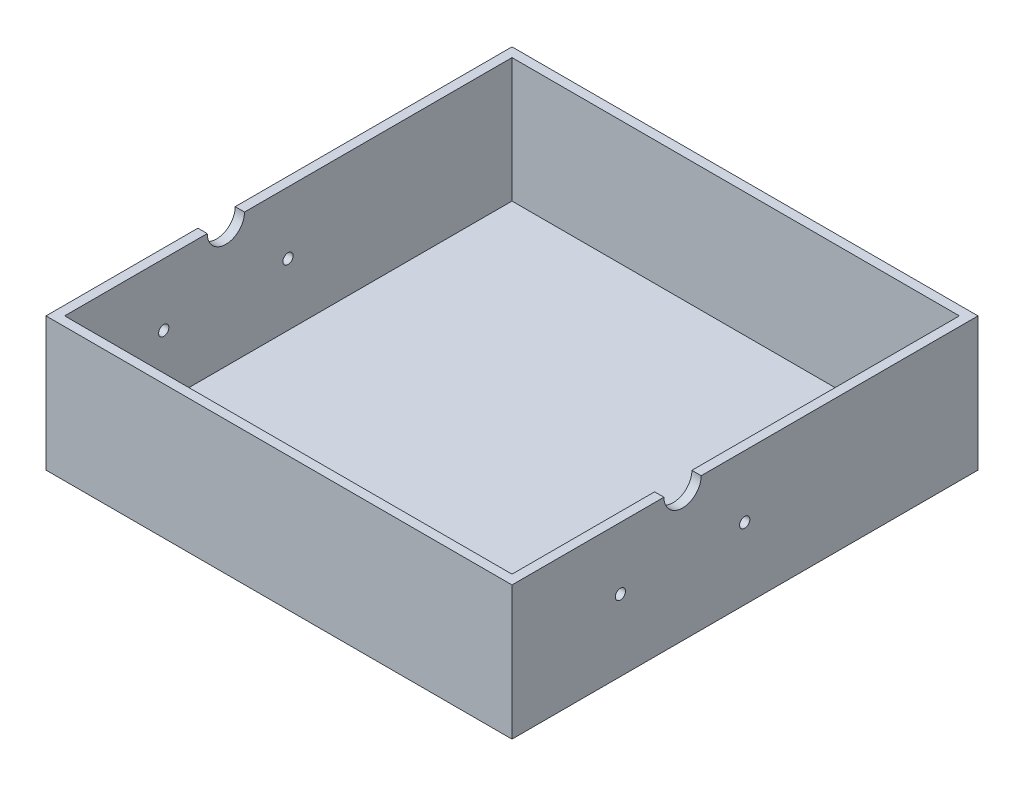
ISO-10303-21;
HEADER;
FILE_DESCRIPTION(('STEP AP214'),'2;1');
FILE_NAME('part.step','',(''),(''),'','','');
FILE_SCHEMA(('AUTOMOTIVE_DESIGN { 1 0 10303 214 1 1 1 1 }'));
ENDSEC;
DATA;
#1=APPLICATION_CONTEXT('core data for automotive mechanical design processes');
#2=APPLICATION_PROTOCOL_DEFINITION('international standard','automotive_design',2000,#1);
#3=PRODUCT_CONTEXT('',#1,'mechanical');
#4=PRODUCT('Part','Part','',(#3));
#5=PRODUCT_RELATED_PRODUCT_CATEGORY('part','',(#4));
#6=PRODUCT_DEFINITION_FORMATION('','',#4);
#7=PRODUCT_DEFINITION_CONTEXT('part definition',#1,'design');
#8=PRODUCT_DEFINITION('design','',#6,#7);
#9=PRODUCT_DEFINITION_SHAPE('','',#8);
#10=(LENGTH_UNIT() NAMED_UNIT(*) SI_UNIT(.MILLI.,.METRE.));
#11=(NAMED_UNIT(*) PLANE_ANGLE_UNIT() SI_UNIT($,.RADIAN.));
#12=(NAMED_UNIT(*) SI_UNIT($,.STERADIAN.) SOLID_ANGLE_UNIT());
#13=UNCERTAINTY_MEASURE_WITH_UNIT(LENGTH_MEASURE(1.E-05),#10,'distance_accuracy_value','');
#14=(GEOMETRIC_REPRESENTATION_CONTEXT(3) GLOBAL_UNCERTAINTY_ASSIGNED_CONTEXT((#13)) GLOBAL_UNIT_ASSIGNED_CONTEXT((#10,
#11,#12)) REPRESENTATION_CONTEXT('',''));
#15=CARTESIAN_POINT('',(0.,0.,0.));
#16=DIRECTION('',(0.,0.,1.));
#17=DIRECTION('',(1.,0.,0.));
#18=AXIS2_PLACEMENT_3D('',#15,#16,#17);
#19=CARTESIAN_POINT('',(0.,43.,0.));
#20=DIRECTION('',(0.,1.,0.));
#21=DIRECTION('',(0.,0.,1.));
#22=AXIS2_PLACEMENT_3D('',#19,#20,#21);
#23=PLANE('',#22);
#24=DIRECTION('',(1.,0.,0.));
#25=VECTOR('',#24,1.);
#26=CARTESIAN_POINT('',(-75.,43.,26.1));
#27=LINE('',#26,#25);
#28=CARTESIAN_POINT('',(-75.,43.,26.1));
#29=VERTEX_POINT('',#28);
#30=CARTESIAN_POINT('',(-72.,43.,26.1));
#31=VERTEX_POINT('',#30);
#32=EDGE_CURVE('E55',#29,#31,#27,.T.);
#33=ORIENTED_EDGE('',*,*,#32,.F.);
#34=DIRECTION('',(0.,0.,1.));
#35=VECTOR('',#34,1.);
#36=CARTESIAN_POINT('',(-75.,43.,75.));
#37=LINE('',#36,#35);
#38=CARTESIAN_POINT('',(-75.,43.,75.));
#39=VERTEX_POINT('',#38);
#40=EDGE_CURVE('E144',#29,#39,#37,.T.);
#41=ORIENTED_EDGE('',*,*,#40,.T.);
#42=DIRECTION('',(1.,0.,0.));
#43=VECTOR('',#42,1.);
#44=CARTESIAN_POINT('',(75.,43.,75.));
#45=LINE('',#44,#43);
#46=CARTESIAN_POINT('',(75.,43.,75.));
#47=VERTEX_POINT('',#46);
#48=EDGE_CURVE('E154',#39,#47,#45,.T.);
#49=ORIENTED_EDGE('',*,*,#48,.T.);
#50=DIRECTION('',(0.,0.,-1.));
#51=VECTOR('',#50,1.);
#52=CARTESIAN_POINT('',(75.,43.,75.));
#53=LINE('',#52,#51);
#54=CARTESIAN_POINT('',(75.,43.,26.1));
#55=VERTEX_POINT('',#54);
#56=EDGE_CURVE('E165',#47,#55,#53,.T.);
#57=ORIENTED_EDGE('',*,*,#56,.T.);
#58=CARTESIAN_POINT('',(72.,43.,26.1));
#59=VERTEX_POINT('',#58);
#60=EDGE_CURVE('E220',#59,#55,#27,.T.);
#61=ORIENTED_EDGE('',*,*,#60,.F.);
#62=DIRECTION('',(0.,0.,-1.));
#63=VECTOR('',#62,1.);
#64=CARTESIAN_POINT('',(72.,43.,72.));
#65=LINE('',#64,#63);
#66=CARTESIAN_POINT('',(72.,43.,72.));
#67=VERTEX_POINT('',#66);
#68=EDGE_CURVE('E233',#67,#59,#65,.T.);
#69=ORIENTED_EDGE('',*,*,#68,.F.);
#70=DIRECTION('',(1.,0.,0.));
#71=VECTOR('',#70,1.);
#72=CARTESIAN_POINT('',(72.,43.,72.));
#73=LINE('',#72,#71);
#74=CARTESIAN_POINT('',(-72.,43.,72.));
#75=VERTEX_POINT('',#74);
#76=EDGE_CURVE('E228',#75,#67,#73,.T.);
#77=ORIENTED_EDGE('',*,*,#76,.F.);
#78=DIRECTION('',(0.,0.,1.));
#79=VECTOR('',#78,1.);
#80=CARTESIAN_POINT('',(-72.,43.,72.));
#81=LINE('',#80,#79);
#82=EDGE_CURVE('E229',#31,#75,#81,.T.);
#83=ORIENTED_EDGE('',*,*,#82,.F.);
#84=EDGE_LOOP('',(#33,#41,#49,#57,#61,#69,#77,#83));
#85=FACE_BOUND('',#84,.T.);
#86=ADVANCED_FACE('F39',(#85),#23,.T.);
#87=CARTESIAN_POINT('',(75.,3.,75.));
#88=DIRECTION('',(-1.,0.,0.));
#89=DIRECTION('',(0.,0.,1.));
#90=AXIS2_PLACEMENT_3D('',#87,#88,#89);
#91=PLANE('',#90);
#92=CARTESIAN_POINT('',(75.,23.,0.0999999999999959));
#93=DIRECTION('',(1.,0.,0.));
#94=DIRECTION('',(0.,0.,-1.));
#95=AXIS2_PLACEMENT_3D('',#92,#93,#94);
#96=CIRCLE('',#95,1.65);
#97=CARTESIAN_POINT('',(75.,23.,-1.55));
#98=VERTEX_POINT('',#97);
#99=EDGE_CURVE('E306',#98,#98,#96,.T.);
#100=ORIENTED_EDGE('',*,*,#99,.F.);
#101=EDGE_LOOP('',(#100));
#102=FACE_BOUND('',#101,.T.);
#103=CARTESIAN_POINT('',(75.,23.,40.1));
#104=DIRECTION('',(1.,0.,0.));
#105=DIRECTION('',(0.,0.,-1.));
#106=AXIS2_PLACEMENT_3D('',#103,#104,#105);
#107=CIRCLE('',#106,1.65);
#108=CARTESIAN_POINT('',(75.,23.,38.45));
#109=VERTEX_POINT('',#108);
#110=EDGE_CURVE('E216',#109,#109,#107,.T.);
#111=ORIENTED_EDGE('',*,*,#110,.F.);
#112=EDGE_LOOP('',(#111));
#113=FACE_BOUND('',#112,.T.);
#114=CARTESIAN_POINT('',(75.,43.,14.1));
#115=VERTEX_POINT('',#114);
#116=CARTESIAN_POINT('',(75.,43.,-75.));
#117=VERTEX_POINT('',#116);
#118=EDGE_CURVE('E159',#115,#117,#53,.T.);
#119=ORIENTED_EDGE('',*,*,#118,.F.);
#120=CARTESIAN_POINT('',(75.,43.,20.1));
#121=DIRECTION('',(1.,0.,0.));
#122=DIRECTION('',(0.,0.,-1.));
#123=AXIS2_PLACEMENT_3D('',#120,#121,#122);
#124=CIRCLE('',#123,6.);
#125=EDGE_CURVE('E147',#55,#115,#124,.T.);
#126=ORIENTED_EDGE('',*,*,#125,.F.);
#127=ORIENTED_EDGE('',*,*,#56,.F.);
#128=DIRECTION('',(0.,-1.,0.));
#129=VECTOR('',#128,1.);
#130=CARTESIAN_POINT('',(75.,3.,75.));
#131=LINE('',#130,#129);
#132=CARTESIAN_POINT('',(75.,0.,75.));
#133=VERTEX_POINT('',#132);
#134=EDGE_CURVE('E184',#47,#133,#131,.T.);
#135=ORIENTED_EDGE('',*,*,#134,.T.);
#136=DIRECTION('',(0.,0.,-1.));
#137=VECTOR('',#136,1.);
#138=CARTESIAN_POINT('',(75.,0.,75.));
#139=LINE('',#138,#137);
#140=CARTESIAN_POINT('',(75.,0.,-75.));
#141=VERTEX_POINT('',#140);
#142=EDGE_CURVE('E171',#133,#141,#139,.T.);
#143=ORIENTED_EDGE('',*,*,#142,.T.);
#144=DIRECTION('',(0.,-1.,0.));
#145=VECTOR('',#144,1.);
#146=CARTESIAN_POINT('',(75.,3.,-75.));
#147=LINE('',#146,#145);
#148=EDGE_CURVE('E48',#117,#141,#147,.T.);
#149=ORIENTED_EDGE('',*,*,#148,.F.);
#150=EDGE_LOOP('',(#119,#126,#127,#135,#143,#149));
#151=FACE_BOUND('',#150,.T.);
#152=ADVANCED_FACE('F41',(#102,#113,#151),#91,.F.);
#153=CARTESIAN_POINT('',(-75.,3.,-75.));
#154=DIRECTION('',(0.,0.,1.));
#155=DIRECTION('',(1.,0.,0.));
#156=AXIS2_PLACEMENT_3D('',#153,#154,#155);
#157=PLANE('',#156);
#158=DIRECTION('',(-1.,0.,0.));
#159=VECTOR('',#158,1.);
#160=CARTESIAN_POINT('',(-75.,0.,-75.));
#161=LINE('',#160,#159);
#162=CARTESIAN_POINT('',(-75.,0.,-75.));
#163=VERTEX_POINT('',#162);
#164=EDGE_CURVE('E175',#141,#163,#161,.T.);
#165=ORIENTED_EDGE('',*,*,#164,.T.);
#166=DIRECTION('',(0.,-1.,0.));
#167=VECTOR('',#166,1.);
#168=CARTESIAN_POINT('',(-75.,3.,-75.));
#169=LINE('',#168,#167);
#170=CARTESIAN_POINT('',(-75.,43.,-75.));
#171=VERTEX_POINT('',#170);
#172=EDGE_CURVE('E192',#171,#163,#169,.T.);
#173=ORIENTED_EDGE('',*,*,#172,.F.);
#174=DIRECTION('',(-1.,0.,0.));
#175=VECTOR('',#174,1.);
#176=CARTESIAN_POINT('',(75.,43.,-75.));
#177=LINE('',#176,#175);
#178=EDGE_CURVE('E152',#117,#171,#177,.T.);
#179=ORIENTED_EDGE('',*,*,#178,.F.);
#180=ORIENTED_EDGE('',*,*,#148,.T.);
#181=EDGE_LOOP('',(#165,#173,#179,#180));
#182=FACE_BOUND('',#181,.T.);
#183=ADVANCED_FACE('F323',(#182),#157,.F.);
#184=CARTESIAN_POINT('',(-75.,3.,75.));
#185=DIRECTION('',(1.,0.,0.));
#186=DIRECTION('',(0.,0.,-1.));
#187=AXIS2_PLACEMENT_3D('',#184,#185,#186);
#188=PLANE('',#187);
#189=CARTESIAN_POINT('',(-75.,23.,0.0999999999999959));
#190=DIRECTION('',(1.,0.,0.));
#191=DIRECTION('',(0.,0.,-1.));
#192=AXIS2_PLACEMENT_3D('',#189,#190,#191);
#193=CIRCLE('',#192,1.65);
#194=CARTESIAN_POINT('',(-75.,23.,-1.55));
#195=VERTEX_POINT('',#194);
#196=EDGE_CURVE('E302',#195,#195,#193,.T.);
#197=ORIENTED_EDGE('',*,*,#196,.T.);
#198=EDGE_LOOP('',(#197));
#199=FACE_BOUND('',#198,.T.);
#200=CARTESIAN_POINT('',(-75.,23.,40.1));
#201=DIRECTION('',(1.,0.,0.));
#202=DIRECTION('',(0.,0.,-1.));
#203=AXIS2_PLACEMENT_3D('',#200,#201,#202);
#204=CIRCLE('',#203,1.65);
#205=CARTESIAN_POINT('',(-75.,23.,38.45));
#206=VERTEX_POINT('',#205);
#207=EDGE_CURVE('E311',#206,#206,#204,.T.);
#208=ORIENTED_EDGE('',*,*,#207,.T.);
#209=EDGE_LOOP('',(#208));
#210=FACE_BOUND('',#209,.T.);
#211=ORIENTED_EDGE('',*,*,#40,.F.);
#212=CARTESIAN_POINT('',(-75.,43.,20.1));
#213=DIRECTION('',(1.,0.,0.));
#214=DIRECTION('',(0.,0.,-1.));
#215=AXIS2_PLACEMENT_3D('',#212,#213,#214);
#216=CIRCLE('',#215,6.);
#217=CARTESIAN_POINT('',(-75.,43.,14.1));
#218=VERTEX_POINT('',#217);
#219=EDGE_CURVE('E129',#29,#218,#216,.T.);
#220=ORIENTED_EDGE('',*,*,#219,.T.);
#221=EDGE_CURVE('E142',#171,#218,#37,.T.);
#222=ORIENTED_EDGE('',*,*,#221,.F.);
#223=ORIENTED_EDGE('',*,*,#172,.T.);
#224=DIRECTION('',(0.,0.,1.));
#225=VECTOR('',#224,1.);
#226=CARTESIAN_POINT('',(-75.,0.,75.));
#227=LINE('',#226,#225);
#228=CARTESIAN_POINT('',(-75.,0.,75.));
#229=VERTEX_POINT('',#228);
#230=EDGE_CURVE('E178',#163,#229,#227,.T.);
#231=ORIENTED_EDGE('',*,*,#230,.T.);
#232=DIRECTION('',(0.,-1.,0.));
#233=VECTOR('',#232,1.);
#234=CARTESIAN_POINT('',(-75.,3.,75.));
#235=LINE('',#234,#233);
#236=EDGE_CURVE('E188',#39,#229,#235,.T.);
#237=ORIENTED_EDGE('',*,*,#236,.F.);
#238=EDGE_LOOP('',(#211,#220,#222,#223,#231,#237));
#239=FACE_BOUND('',#238,.T.);
#240=ADVANCED_FACE('F140',(#199,#210,#239),#188,.F.);
#241=CARTESIAN_POINT('',(-75.,3.,75.));
#242=DIRECTION('',(0.,0.,-1.));
#243=DIRECTION('',(-1.,0.,0.));
#244=AXIS2_PLACEMENT_3D('',#241,#242,#243);
#245=PLANE('',#244);
#246=DIRECTION('',(1.,0.,0.));
#247=VECTOR('',#246,1.);
#248=CARTESIAN_POINT('',(-75.,0.,75.));
#249=LINE('',#248,#247);
#250=EDGE_CURVE('E181',#229,#133,#249,.T.);
#251=ORIENTED_EDGE('',*,*,#250,.T.);
#252=ORIENTED_EDGE('',*,*,#134,.F.);
#253=ORIENTED_EDGE('',*,*,#48,.F.);
#254=ORIENTED_EDGE('',*,*,#236,.T.);
#255=EDGE_LOOP('',(#251,#252,#253,#254));
#256=FACE_BOUND('',#255,.T.);
#257=ADVANCED_FACE('F356',(#256),#245,.F.);
#258=CARTESIAN_POINT('',(0.,0.,0.));
#259=DIRECTION('',(0.,-1.,0.));
#260=DIRECTION('',(0.,0.,-1.));
#261=AXIS2_PLACEMENT_3D('',#258,#259,#260);
#262=PLANE('',#261);
#263=ORIENTED_EDGE('',*,*,#142,.F.);
#264=ORIENTED_EDGE('',*,*,#250,.F.);
#265=ORIENTED_EDGE('',*,*,#230,.F.);
#266=ORIENTED_EDGE('',*,*,#164,.F.);
#267=EDGE_LOOP('',(#263,#264,#265,#266));
#268=FACE_BOUND('',#267,.T.);
#269=ADVANCED_FACE('F361',(#268),#262,.T.);
#270=DIRECTION('',(1.,0.,0.));
#271=VECTOR('',#270,1.);
#272=CARTESIAN_POINT('',(-75.,43.,14.1));
#273=LINE('',#272,#271);
#274=CARTESIAN_POINT('',(72.,43.,14.1));
#275=VERTEX_POINT('',#274);
#276=EDGE_CURVE('E62',#115,#275,#273,.F.);
#277=ORIENTED_EDGE('',*,*,#276,.F.);
#278=ORIENTED_EDGE('',*,*,#118,.T.);
#279=ORIENTED_EDGE('',*,*,#178,.T.);
#280=ORIENTED_EDGE('',*,*,#221,.T.);
#281=CARTESIAN_POINT('',(-72.,43.,14.1));
#282=VERTEX_POINT('',#281);
#283=EDGE_CURVE('E126',#282,#218,#273,.F.);
#284=ORIENTED_EDGE('',*,*,#283,.F.);
#285=CARTESIAN_POINT('',(-72.,43.,-72.));
#286=VERTEX_POINT('',#285);
#287=EDGE_CURVE('E225',#286,#282,#81,.T.);
#288=ORIENTED_EDGE('',*,*,#287,.F.);
#289=DIRECTION('',(-1.,0.,0.));
#290=VECTOR('',#289,1.);
#291=CARTESIAN_POINT('',(72.,43.,-72.));
#292=LINE('',#291,#290);
#293=CARTESIAN_POINT('',(72.,43.,-72.));
#294=VERTEX_POINT('',#293);
#295=EDGE_CURVE('E237',#294,#286,#292,.T.);
#296=ORIENTED_EDGE('',*,*,#295,.F.);
#297=EDGE_CURVE('E232',#275,#294,#65,.T.);
#298=ORIENTED_EDGE('',*,*,#297,.F.);
#299=EDGE_LOOP('',(#277,#278,#279,#280,#284,#288,#296,#298));
#300=FACE_BOUND('',#299,.T.);
#301=ADVANCED_FACE('F150',(#300),#23,.T.);
#302=CARTESIAN_POINT('',(-72.,43.,72.));
#303=DIRECTION('',(1.,0.,0.));
#304=DIRECTION('',(0.,0.,-1.));
#305=AXIS2_PLACEMENT_3D('',#302,#303,#304);
#306=PLANE('',#305);
#307=CARTESIAN_POINT('',(-72.,43.,20.1));
#308=DIRECTION('',(1.,0.,0.));
#309=DIRECTION('',(0.,0.,-1.));
#310=AXIS2_PLACEMENT_3D('',#307,#308,#309);
#311=CIRCLE('',#310,6.);
#312=EDGE_CURVE('E130',#31,#282,#311,.T.);
#313=ORIENTED_EDGE('',*,*,#312,.F.);
#314=ORIENTED_EDGE('',*,*,#82,.T.);
#315=DIRECTION('',(0.,-1.,0.));
#316=VECTOR('',#315,1.);
#317=CARTESIAN_POINT('',(-72.,43.,72.));
#318=LINE('',#317,#316);
#319=CARTESIAN_POINT('',(-72.,3.,72.));
#320=VERTEX_POINT('',#319);
#321=EDGE_CURVE('E161',#75,#320,#318,.T.);
#322=ORIENTED_EDGE('',*,*,#321,.T.);
#323=DIRECTION('',(0.,0.,1.));
#324=VECTOR('',#323,1.);
#325=CARTESIAN_POINT('',(-72.,3.,72.));
#326=LINE('',#325,#324);
#327=CARTESIAN_POINT('',(-72.,3.,-72.));
#328=VERTEX_POINT('',#327);
#329=EDGE_CURVE('E241',#328,#320,#326,.T.);
#330=ORIENTED_EDGE('',*,*,#329,.F.);
#331=DIRECTION('',(0.,-1.,0.));
#332=VECTOR('',#331,1.);
#333=CARTESIAN_POINT('',(-72.,43.,-72.));
#334=LINE('',#333,#332);
#335=EDGE_CURVE('E240',#286,#328,#334,.T.);
#336=ORIENTED_EDGE('',*,*,#335,.F.);
#337=ORIENTED_EDGE('',*,*,#287,.T.);
#338=EDGE_LOOP('',(#313,#314,#322,#330,#336,#337));
#339=FACE_BOUND('',#338,.T.);
#340=CARTESIAN_POINT('',(-72.,23.,0.0999999999999959));
#341=DIRECTION('',(1.,0.,0.));
#342=DIRECTION('',(0.,0.,-1.));
#343=AXIS2_PLACEMENT_3D('',#340,#341,#342);
#344=CIRCLE('',#343,1.65);
#345=CARTESIAN_POINT('',(-72.,23.,-1.55));
#346=VERTEX_POINT('',#345);
#347=EDGE_CURVE('E204',#346,#346,#344,.T.);
#348=ORIENTED_EDGE('',*,*,#347,.F.);
#349=EDGE_LOOP('',(#348));
#350=FACE_BOUND('',#349,.T.);
#351=CARTESIAN_POINT('',(-72.,23.,40.1));
#352=DIRECTION('',(1.,0.,0.));
#353=DIRECTION('',(0.,0.,-1.));
#354=AXIS2_PLACEMENT_3D('',#351,#352,#353);
#355=CIRCLE('',#354,1.65);
#356=CARTESIAN_POINT('',(-72.,23.,38.45));
#357=VERTEX_POINT('',#356);
#358=EDGE_CURVE('E200',#357,#357,#355,.T.);
#359=ORIENTED_EDGE('',*,*,#358,.F.);
#360=EDGE_LOOP('',(#359));
#361=FACE_BOUND('',#360,.T.);
#362=ADVANCED_FACE('F271',(#339,#350,#361),#306,.T.);
#363=CARTESIAN_POINT('',(72.,43.,72.));
#364=DIRECTION('',(0.,0.,-1.));
#365=DIRECTION('',(-1.,0.,0.));
#366=AXIS2_PLACEMENT_3D('',#363,#364,#365);
#367=PLANE('',#366);
#368=DIRECTION('',(1.,0.,0.));
#369=VECTOR('',#368,1.);
#370=CARTESIAN_POINT('',(72.,3.,72.));
#371=LINE('',#370,#369);
#372=CARTESIAN_POINT('',(72.,3.,72.));
#373=VERTEX_POINT('',#372);
#374=EDGE_CURVE('E245',#320,#373,#371,.T.);
#375=ORIENTED_EDGE('',*,*,#374,.F.);
#376=ORIENTED_EDGE('',*,*,#321,.F.);
#377=ORIENTED_EDGE('',*,*,#76,.T.);
#378=DIRECTION('',(0.,-1.,0.));
#379=VECTOR('',#378,1.);
#380=CARTESIAN_POINT('',(72.,43.,72.));
#381=LINE('',#380,#379);
#382=EDGE_CURVE('E261',#67,#373,#381,.T.);
#383=ORIENTED_EDGE('',*,*,#382,.T.);
#384=EDGE_LOOP('',(#375,#376,#377,#383));
#385=FACE_BOUND('',#384,.T.);
#386=ADVANCED_FACE('F373',(#385),#367,.T.);
#387=CARTESIAN_POINT('',(72.,43.,72.));
#388=DIRECTION('',(-1.,0.,0.));
#389=DIRECTION('',(0.,0.,1.));
#390=AXIS2_PLACEMENT_3D('',#387,#388,#389);
#391=PLANE('',#390);
#392=CARTESIAN_POINT('',(72.,43.,20.1));
#393=DIRECTION('',(-1.,0.,0.));
#394=DIRECTION('',(0.,0.,1.));
#395=AXIS2_PLACEMENT_3D('',#392,#393,#394);
#396=CIRCLE('',#395,6.);
#397=EDGE_CURVE('E11',#275,#59,#396,.T.);
#398=ORIENTED_EDGE('',*,*,#397,.F.);
#399=ORIENTED_EDGE('',*,*,#297,.T.);
#400=DIRECTION('',(0.,-1.,0.));
#401=VECTOR('',#400,1.);
#402=CARTESIAN_POINT('',(72.,43.,-72.));
#403=LINE('',#402,#401);
#404=CARTESIAN_POINT('',(72.,3.,-72.));
#405=VERTEX_POINT('',#404);
#406=EDGE_CURVE('E259',#294,#405,#403,.T.);
#407=ORIENTED_EDGE('',*,*,#406,.T.);
#408=DIRECTION('',(0.,0.,-1.));
#409=VECTOR('',#408,1.);
#410=CARTESIAN_POINT('',(72.,3.,72.));
#411=LINE('',#410,#409);
#412=EDGE_CURVE('E249',#373,#405,#411,.T.);
#413=ORIENTED_EDGE('',*,*,#412,.F.);
#414=ORIENTED_EDGE('',*,*,#382,.F.);
#415=ORIENTED_EDGE('',*,*,#68,.T.);
#416=EDGE_LOOP('',(#398,#399,#407,#413,#414,#415));
#417=FACE_BOUND('',#416,.T.);
#418=CARTESIAN_POINT('',(72.,23.,0.0999999999999959));
#419=DIRECTION('',(-1.,0.,0.));
#420=DIRECTION('',(0.,0.,1.));
#421=AXIS2_PLACEMENT_3D('',#418,#419,#420);
#422=CIRCLE('',#421,1.65);
#423=CARTESIAN_POINT('',(72.,23.,1.75));
#424=VERTEX_POINT('',#423);
#425=EDGE_CURVE('E201',#424,#424,#422,.T.);
#426=ORIENTED_EDGE('',*,*,#425,.F.);
#427=EDGE_LOOP('',(#426));
#428=FACE_BOUND('',#427,.T.);
#429=CARTESIAN_POINT('',(72.,23.,40.1));
#430=DIRECTION('',(-1.,0.,0.));
#431=DIRECTION('',(0.,0.,1.));
#432=AXIS2_PLACEMENT_3D('',#429,#430,#431);
#433=CIRCLE('',#432,1.65);
#434=CARTESIAN_POINT('',(72.,23.,41.75));
#435=VERTEX_POINT('',#434);
#436=EDGE_CURVE('E146',#435,#435,#433,.T.);
#437=ORIENTED_EDGE('',*,*,#436,.F.);
#438=EDGE_LOOP('',(#437));
#439=FACE_BOUND('',#438,.T.);
#440=ADVANCED_FACE('F289',(#417,#428,#439),#391,.T.);
#441=CARTESIAN_POINT('',(72.,43.,-72.));
#442=DIRECTION('',(0.,0.,1.));
#443=DIRECTION('',(1.,0.,0.));
#444=AXIS2_PLACEMENT_3D('',#441,#442,#443);
#445=PLANE('',#444);
#446=DIRECTION('',(-1.,0.,0.));
#447=VECTOR('',#446,1.);
#448=CARTESIAN_POINT('',(72.,3.,-72.));
#449=LINE('',#448,#447);
#450=EDGE_CURVE('E253',#405,#328,#449,.T.);
#451=ORIENTED_EDGE('',*,*,#450,.F.);
#452=ORIENTED_EDGE('',*,*,#406,.F.);
#453=ORIENTED_EDGE('',*,*,#295,.T.);
#454=ORIENTED_EDGE('',*,*,#335,.T.);
#455=EDGE_LOOP('',(#451,#452,#453,#454));
#456=FACE_BOUND('',#455,.T.);
#457=ADVANCED_FACE('F281',(#456),#445,.T.);
#458=CARTESIAN_POINT('',(0.,3.,0.));
#459=DIRECTION('',(0.,-1.,0.));
#460=DIRECTION('',(0.,0.,-1.));
#461=AXIS2_PLACEMENT_3D('',#458,#459,#460);
#462=PLANE('',#461);
#463=ORIENTED_EDGE('',*,*,#450,.T.);
#464=ORIENTED_EDGE('',*,*,#329,.T.);
#465=ORIENTED_EDGE('',*,*,#374,.T.);
#466=ORIENTED_EDGE('',*,*,#412,.T.);
#467=EDGE_LOOP('',(#463,#464,#465,#466));
#468=FACE_BOUND('',#467,.T.);
#469=ADVANCED_FACE('F277',(#468),#462,.F.);
#470=CARTESIAN_POINT('',(-75.,23.,40.1));
#471=DIRECTION('',(1.,0.,0.));
#472=DIRECTION('',(0.,0.,-1.));
#473=AXIS2_PLACEMENT_3D('',#470,#471,#472);
#474=CYLINDRICAL_SURFACE('',#473,1.65);
#475=ORIENTED_EDGE('',*,*,#436,.T.);
#476=EDGE_LOOP('',(#475));
#477=FACE_BOUND('',#476,.T.);
#478=ORIENTED_EDGE('',*,*,#110,.T.);
#479=EDGE_LOOP('',(#478));
#480=FACE_BOUND('',#479,.T.);
#481=ADVANCED_FACE('F320',(#477,#480),#474,.F.);
#482=CARTESIAN_POINT('',(-75.,23.,0.0999999999999959));
#483=DIRECTION('',(1.,0.,0.));
#484=DIRECTION('',(0.,0.,-1.));
#485=AXIS2_PLACEMENT_3D('',#482,#483,#484);
#486=CYLINDRICAL_SURFACE('',#485,1.65);
#487=ORIENTED_EDGE('',*,*,#425,.T.);
#488=EDGE_LOOP('',(#487));
#489=FACE_BOUND('',#488,.T.);
#490=ORIENTED_EDGE('',*,*,#99,.T.);
#491=EDGE_LOOP('',(#490));
#492=FACE_BOUND('',#491,.T.);
#493=ADVANCED_FACE('F333',(#489,#492),#486,.F.);
#494=CARTESIAN_POINT('',(-75.,43.,20.1));
#495=DIRECTION('',(1.,0.,0.));
#496=DIRECTION('',(0.,0.,-1.));
#497=AXIS2_PLACEMENT_3D('',#494,#495,#496);
#498=CYLINDRICAL_SURFACE('',#497,6.);
#499=ORIENTED_EDGE('',*,*,#60,.T.);
#500=ORIENTED_EDGE('',*,*,#125,.T.);
#501=ORIENTED_EDGE('',*,*,#276,.T.);
#502=ORIENTED_EDGE('',*,*,#397,.T.);
#503=EDGE_LOOP('',(#499,#500,#501,#502));
#504=FACE_BOUND('',#503,.T.);
#505=ADVANCED_FACE('F293',(#504),#498,.F.);
#506=ORIENTED_EDGE('',*,*,#358,.T.);
#507=EDGE_LOOP('',(#506));
#508=FACE_BOUND('',#507,.T.);
#509=ORIENTED_EDGE('',*,*,#207,.F.);
#510=EDGE_LOOP('',(#509));
#511=FACE_BOUND('',#510,.T.);
#512=ADVANCED_FACE('F341',(#508,#511),#474,.F.);
#513=ORIENTED_EDGE('',*,*,#347,.T.);
#514=EDGE_LOOP('',(#513));
#515=FACE_BOUND('',#514,.T.);
#516=ORIENTED_EDGE('',*,*,#196,.F.);
#517=EDGE_LOOP('',(#516));
#518=FACE_BOUND('',#517,.T.);
#519=ADVANCED_FACE('F336',(#515,#518),#486,.F.);
#520=ORIENTED_EDGE('',*,*,#32,.T.);
#521=ORIENTED_EDGE('',*,*,#312,.T.);
#522=ORIENTED_EDGE('',*,*,#283,.T.);
#523=ORIENTED_EDGE('',*,*,#219,.F.);
#524=EDGE_LOOP('',(#520,#521,#522,#523));
#525=FACE_BOUND('',#524,.T.);
#526=ADVANCED_FACE('F128',(#525),#498,.F.);
#527=CLOSED_SHELL('',(#86,#152,#183,#240,#257,#269,#301,#362,#386,#440,#457,#469,#481,#493,#505,
#512,#519,#526));
#528=MANIFOLD_SOLID_BREP('B2',#527);
#529=ADVANCED_BREP_SHAPE_REPRESENTATION('',(#18,#528),#14);
#530=SHAPE_DEFINITION_REPRESENTATION(#9,#529);
ENDSEC;
END-ISO-10303-21;
